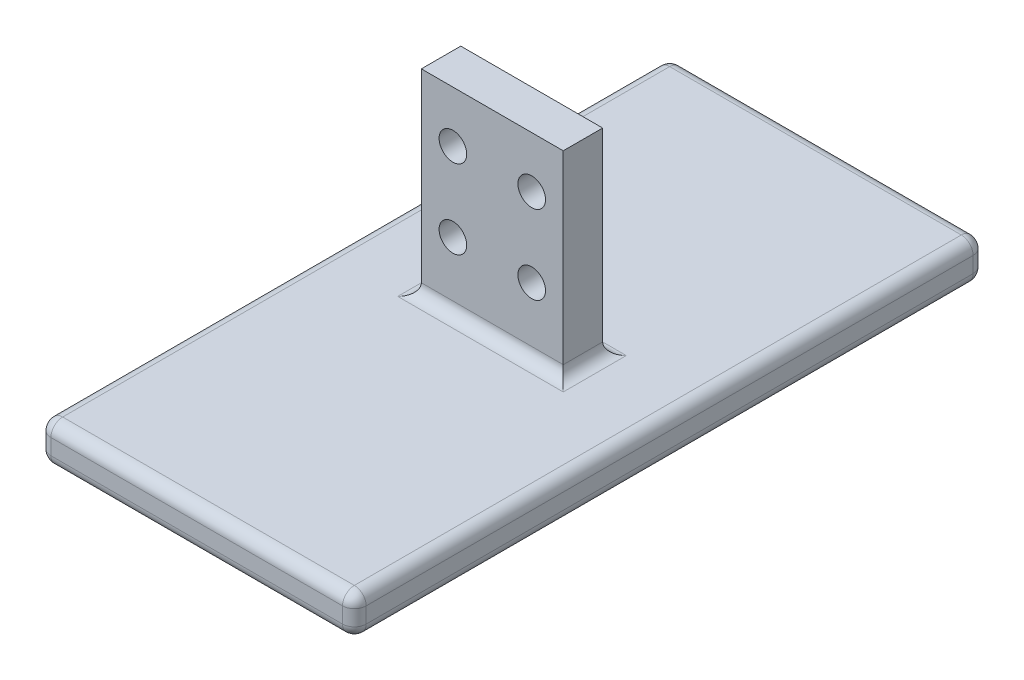
ISO-10303-21;
HEADER;
FILE_DESCRIPTION(('STEP AP214'),'2;1');
FILE_NAME('part.step','',(''),(''),'','','');
FILE_SCHEMA(('AUTOMOTIVE_DESIGN { 1 0 10303 214 1 1 1 1 }'));
ENDSEC;
DATA;
#1=APPLICATION_CONTEXT('core data for automotive mechanical design processes');
#2=APPLICATION_PROTOCOL_DEFINITION('international standard','automotive_design',2000,#1);
#3=PRODUCT_CONTEXT('',#1,'mechanical');
#4=PRODUCT('Part','Part','',(#3));
#5=PRODUCT_RELATED_PRODUCT_CATEGORY('part','',(#4));
#6=PRODUCT_DEFINITION_FORMATION('','',#4);
#7=PRODUCT_DEFINITION_CONTEXT('part definition',#1,'design');
#8=PRODUCT_DEFINITION('design','',#6,#7);
#9=PRODUCT_DEFINITION_SHAPE('','',#8);
#10=(LENGTH_UNIT() NAMED_UNIT(*) SI_UNIT(.MILLI.,.METRE.));
#11=(NAMED_UNIT(*) PLANE_ANGLE_UNIT() SI_UNIT($,.RADIAN.));
#12=(NAMED_UNIT(*) SI_UNIT($,.STERADIAN.) SOLID_ANGLE_UNIT());
#13=UNCERTAINTY_MEASURE_WITH_UNIT(LENGTH_MEASURE(1.E-05),#10,'distance_accuracy_value','');
#14=(GEOMETRIC_REPRESENTATION_CONTEXT(3) GLOBAL_UNCERTAINTY_ASSIGNED_CONTEXT((#13)) GLOBAL_UNIT_ASSIGNED_CONTEXT((#10,
#11,#12)) REPRESENTATION_CONTEXT('',''));
#15=CARTESIAN_POINT('',(0.,0.,0.));
#16=DIRECTION('',(0.,0.,1.));
#17=DIRECTION('',(1.,0.,0.));
#18=AXIS2_PLACEMENT_3D('',#15,#16,#17);
#19=CARTESIAN_POINT('',(-20.,2.5,-40.));
#20=DIRECTION('',(0.,1.,0.));
#21=DIRECTION('',(0.,0.,1.));
#22=AXIS2_PLACEMENT_3D('',#19,#20,#21);
#23=PLANE('',#22);
#24=DIRECTION('',(0.,0.,1.));
#25=VECTOR('',#24,1.);
#26=CARTESIAN_POINT('',(10.5,2.5,2.5));
#27=LINE('',#26,#25);
#28=CARTESIAN_POINT('',(10.5,2.5,-4.));
#29=VERTEX_POINT('',#28);
#30=CARTESIAN_POINT('',(10.5,2.5,4.));
#31=VERTEX_POINT('',#30);
#32=EDGE_CURVE('E227',#29,#31,#27,.T.);
#33=ORIENTED_EDGE('',*,*,#32,.T.);
#34=DIRECTION('',(1.,0.,0.));
#35=VECTOR('',#34,1.);
#36=CARTESIAN_POINT('',(-9.00000000000001,2.5,4.));
#37=LINE('',#36,#35);
#38=CARTESIAN_POINT('',(-10.5,2.5,4.));
#39=VERTEX_POINT('',#38);
#40=EDGE_CURVE('E229',#31,#39,#37,.F.);
#41=ORIENTED_EDGE('',*,*,#40,.T.);
#42=DIRECTION('',(0.,0.,1.));
#43=VECTOR('',#42,1.);
#44=CARTESIAN_POINT('',(-10.5,2.5,-2.5));
#45=LINE('',#44,#43);
#46=CARTESIAN_POINT('',(-10.5,2.5,-4.));
#47=VERTEX_POINT('',#46);
#48=EDGE_CURVE('E223',#39,#47,#45,.F.);
#49=ORIENTED_EDGE('',*,*,#48,.T.);
#50=DIRECTION('',(1.,0.,0.));
#51=VECTOR('',#50,1.);
#52=CARTESIAN_POINT('',(-20.,2.5,-4.));
#53=LINE('',#52,#51);
#54=EDGE_CURVE('E225',#47,#29,#53,.T.);
#55=ORIENTED_EDGE('',*,*,#54,.T.);
#56=EDGE_LOOP('',(#33,#41,#49,#55));
#57=FACE_BOUND('',#56,.T.);
#58=DIRECTION('',(0.,0.,1.));
#59=VECTOR('',#58,1.);
#60=CARTESIAN_POINT('',(18.5,2.5,-40.));
#61=LINE('',#60,#59);
#62=CARTESIAN_POINT('',(18.5,2.5,38.5));
#63=VERTEX_POINT('',#62);
#64=CARTESIAN_POINT('',(18.5,2.5,-38.5));
#65=VERTEX_POINT('',#64);
#66=EDGE_CURVE('E217',#63,#65,#61,.F.);
#67=ORIENTED_EDGE('',*,*,#66,.T.);
#68=DIRECTION('',(-1.,0.,0.));
#69=VECTOR('',#68,1.);
#70=CARTESIAN_POINT('',(-20.,2.5,-38.5));
#71=LINE('',#70,#69);
#72=CARTESIAN_POINT('',(-18.5,2.5,-38.5));
#73=VERTEX_POINT('',#72);
#74=EDGE_CURVE('E220',#65,#73,#71,.T.);
#75=ORIENTED_EDGE('',*,*,#74,.T.);
#76=DIRECTION('',(0.,0.,1.));
#77=VECTOR('',#76,1.);
#78=CARTESIAN_POINT('',(-18.5,2.5,-40.));
#79=LINE('',#78,#77);
#80=CARTESIAN_POINT('',(-18.5,2.5,38.5));
#81=VERTEX_POINT('',#80);
#82=EDGE_CURVE('E211',#73,#81,#79,.T.);
#83=ORIENTED_EDGE('',*,*,#82,.T.);
#84=DIRECTION('',(-1.,0.,0.));
#85=VECTOR('',#84,1.);
#86=CARTESIAN_POINT('',(-20.,2.5,38.5));
#87=LINE('',#86,#85);
#88=EDGE_CURVE('E214',#81,#63,#87,.F.);
#89=ORIENTED_EDGE('',*,*,#88,.T.);
#90=EDGE_LOOP('',(#67,#75,#83,#89));
#91=FACE_BOUND('',#90,.T.);
#92=ADVANCED_FACE('F35',(#57,#91),#23,.T.);
#93=CARTESIAN_POINT('',(20.,2.5,-40.));
#94=DIRECTION('',(1.,0.,0.));
#95=DIRECTION('',(0.,0.,-1.));
#96=AXIS2_PLACEMENT_3D('',#93,#94,#95);
#97=PLANE('',#96);
#98=DIRECTION('',(0.,0.,1.));
#99=VECTOR('',#98,1.);
#100=CARTESIAN_POINT('',(20.,-1.,-40.));
#101=LINE('',#100,#99);
#102=CARTESIAN_POINT('',(20.,-1.,38.5));
#103=VERTEX_POINT('',#102);
#104=CARTESIAN_POINT('',(20.,-1.,-38.5));
#105=VERTEX_POINT('',#104);
#106=EDGE_CURVE('E244',#103,#105,#101,.F.);
#107=ORIENTED_EDGE('',*,*,#106,.T.);
#108=DIRECTION('',(0.,1.,0.));
#109=VECTOR('',#108,1.);
#110=CARTESIAN_POINT('',(20.,1.,-38.5));
#111=LINE('',#110,#109);
#112=CARTESIAN_POINT('',(20.,1.,-38.5));
#113=VERTEX_POINT('',#112);
#114=EDGE_CURVE('E340',#105,#113,#111,.T.);
#115=ORIENTED_EDGE('',*,*,#114,.T.);
#116=DIRECTION('',(0.,0.,1.));
#117=VECTOR('',#116,1.);
#118=CARTESIAN_POINT('',(20.,1.,-40.));
#119=LINE('',#118,#117);
#120=CARTESIAN_POINT('',(20.,1.,38.5));
#121=VERTEX_POINT('',#120);
#122=EDGE_CURVE('E247',#113,#121,#119,.T.);
#123=ORIENTED_EDGE('',*,*,#122,.T.);
#124=DIRECTION('',(0.,1.,0.));
#125=VECTOR('',#124,1.);
#126=CARTESIAN_POINT('',(20.,2.5,38.5));
#127=LINE('',#126,#125);
#128=EDGE_CURVE('E307',#121,#103,#127,.F.);
#129=ORIENTED_EDGE('',*,*,#128,.T.);
#130=EDGE_LOOP('',(#107,#115,#123,#129));
#131=FACE_BOUND('',#130,.T.);
#132=ADVANCED_FACE('F415',(#131),#97,.T.);
#133=CARTESIAN_POINT('',(-20.,-2.5,-40.));
#134=DIRECTION('',(0.,-1.,0.));
#135=DIRECTION('',(0.,0.,-1.));
#136=AXIS2_PLACEMENT_3D('',#133,#134,#135);
#137=PLANE('',#136);
#138=DIRECTION('',(0.,0.,1.));
#139=VECTOR('',#138,1.);
#140=CARTESIAN_POINT('',(-18.5,-2.5,-40.));
#141=LINE('',#140,#139);
#142=CARTESIAN_POINT('',(-18.5,-2.5,38.5));
#143=VERTEX_POINT('',#142);
#144=CARTESIAN_POINT('',(-18.5,-2.5,-38.5));
#145=VERTEX_POINT('',#144);
#146=EDGE_CURVE('E265',#143,#145,#141,.F.);
#147=ORIENTED_EDGE('',*,*,#146,.T.);
#148=DIRECTION('',(1.,0.,0.));
#149=VECTOR('',#148,1.);
#150=CARTESIAN_POINT('',(20.,-2.5,-38.5));
#151=LINE('',#150,#149);
#152=CARTESIAN_POINT('',(18.5,-2.5,-38.5));
#153=VERTEX_POINT('',#152);
#154=EDGE_CURVE('E268',#145,#153,#151,.T.);
#155=ORIENTED_EDGE('',*,*,#154,.T.);
#156=DIRECTION('',(0.,0.,1.));
#157=VECTOR('',#156,1.);
#158=CARTESIAN_POINT('',(18.5,-2.5,-40.));
#159=LINE('',#158,#157);
#160=CARTESIAN_POINT('',(18.5,-2.5,38.5));
#161=VERTEX_POINT('',#160);
#162=EDGE_CURVE('E259',#153,#161,#159,.T.);
#163=ORIENTED_EDGE('',*,*,#162,.T.);
#164=DIRECTION('',(1.,0.,0.));
#165=VECTOR('',#164,1.);
#166=CARTESIAN_POINT('',(-20.,-2.5,38.5));
#167=LINE('',#166,#165);
#168=EDGE_CURVE('E262',#161,#143,#167,.F.);
#169=ORIENTED_EDGE('',*,*,#168,.T.);
#170=EDGE_LOOP('',(#147,#155,#163,#169));
#171=FACE_BOUND('',#170,.T.);
#172=ADVANCED_FACE('F368',(#171),#137,.T.);
#173=CARTESIAN_POINT('',(-20.,2.5,-40.));
#174=DIRECTION('',(-1.,0.,0.));
#175=DIRECTION('',(0.,0.,1.));
#176=AXIS2_PLACEMENT_3D('',#173,#174,#175);
#177=PLANE('',#176);
#178=DIRECTION('',(0.,0.,1.));
#179=VECTOR('',#178,1.);
#180=CARTESIAN_POINT('',(-20.,1.,-40.));
#181=LINE('',#180,#179);
#182=CARTESIAN_POINT('',(-20.,1.,38.5));
#183=VERTEX_POINT('',#182);
#184=CARTESIAN_POINT('',(-20.,1.,-38.5));
#185=VERTEX_POINT('',#184);
#186=EDGE_CURVE('E257',#183,#185,#181,.F.);
#187=ORIENTED_EDGE('',*,*,#186,.T.);
#188=DIRECTION('',(0.,-1.,0.));
#189=VECTOR('',#188,1.);
#190=CARTESIAN_POINT('',(-20.,-1.,-38.5));
#191=LINE('',#190,#189);
#192=CARTESIAN_POINT('',(-20.,-1.,-38.5));
#193=VERTEX_POINT('',#192);
#194=EDGE_CURVE('E11',#185,#193,#191,.T.);
#195=ORIENTED_EDGE('',*,*,#194,.T.);
#196=DIRECTION('',(0.,0.,1.));
#197=VECTOR('',#196,1.);
#198=CARTESIAN_POINT('',(-20.,-1.,-40.));
#199=LINE('',#198,#197);
#200=CARTESIAN_POINT('',(-20.,-1.,38.5));
#201=VERTEX_POINT('',#200);
#202=EDGE_CURVE('E255',#193,#201,#199,.T.);
#203=ORIENTED_EDGE('',*,*,#202,.T.);
#204=DIRECTION('',(0.,-1.,0.));
#205=VECTOR('',#204,1.);
#206=CARTESIAN_POINT('',(-20.,2.5,38.5));
#207=LINE('',#206,#205);
#208=EDGE_CURVE('E309',#201,#183,#207,.F.);
#209=ORIENTED_EDGE('',*,*,#208,.T.);
#210=EDGE_LOOP('',(#187,#195,#203,#209));
#211=FACE_BOUND('',#210,.T.);
#212=ADVANCED_FACE('F394',(#211),#177,.T.);
#213=CARTESIAN_POINT('',(0.,0.,-40.));
#214=DIRECTION('',(0.,0.,1.));
#215=DIRECTION('',(1.,0.,0.));
#216=AXIS2_PLACEMENT_3D('',#213,#214,#215);
#217=PLANE('',#216);
#218=DIRECTION('',(-1.,0.,0.));
#219=VECTOR('',#218,1.);
#220=CARTESIAN_POINT('',(20.,1.,-40.));
#221=LINE('',#220,#219);
#222=CARTESIAN_POINT('',(-18.5,1.,-40.));
#223=VERTEX_POINT('',#222);
#224=CARTESIAN_POINT('',(18.5,1.,-40.));
#225=VERTEX_POINT('',#224);
#226=EDGE_CURVE('E241',#223,#225,#221,.F.);
#227=ORIENTED_EDGE('',*,*,#226,.T.);
#228=DIRECTION('',(0.,1.,0.));
#229=VECTOR('',#228,1.);
#230=CARTESIAN_POINT('',(18.5,-1.,-40.));
#231=LINE('',#230,#229);
#232=CARTESIAN_POINT('',(18.5,-1.,-40.));
#233=VERTEX_POINT('',#232);
#234=EDGE_CURVE('E44',#225,#233,#231,.F.);
#235=ORIENTED_EDGE('',*,*,#234,.T.);
#236=DIRECTION('',(1.,0.,0.));
#237=VECTOR('',#236,1.);
#238=CARTESIAN_POINT('',(-20.,-1.,-40.));
#239=LINE('',#238,#237);
#240=CARTESIAN_POINT('',(-18.5,-1.,-40.));
#241=VERTEX_POINT('',#240);
#242=EDGE_CURVE('E238',#233,#241,#239,.F.);
#243=ORIENTED_EDGE('',*,*,#242,.T.);
#244=DIRECTION('',(0.,-1.,0.));
#245=VECTOR('',#244,1.);
#246=CARTESIAN_POINT('',(-18.5,1.,-40.));
#247=LINE('',#246,#245);
#248=EDGE_CURVE('E342',#241,#223,#247,.F.);
#249=ORIENTED_EDGE('',*,*,#248,.T.);
#250=EDGE_LOOP('',(#227,#235,#243,#249));
#251=FACE_BOUND('',#250,.T.);
#252=ADVANCED_FACE('F432',(#251),#217,.F.);
#253=CARTESIAN_POINT('',(0.,0.,40.));
#254=DIRECTION('',(0.,0.,1.));
#255=DIRECTION('',(1.,0.,0.));
#256=AXIS2_PLACEMENT_3D('',#253,#254,#255);
#257=PLANE('',#256);
#258=DIRECTION('',(1.,0.,0.));
#259=VECTOR('',#258,1.);
#260=CARTESIAN_POINT('',(0.,-1.,40.));
#261=LINE('',#260,#259);
#262=CARTESIAN_POINT('',(-18.5,-1.,40.));
#263=VERTEX_POINT('',#262);
#264=CARTESIAN_POINT('',(18.5,-1.,40.));
#265=VERTEX_POINT('',#264);
#266=EDGE_CURVE('E249',#263,#265,#261,.T.);
#267=ORIENTED_EDGE('',*,*,#266,.T.);
#268=DIRECTION('',(0.,1.,0.));
#269=VECTOR('',#268,1.);
#270=CARTESIAN_POINT('',(18.5,0.,40.));
#271=LINE('',#270,#269);
#272=CARTESIAN_POINT('',(18.5,1.,40.));
#273=VERTEX_POINT('',#272);
#274=EDGE_CURVE('E305',#265,#273,#271,.T.);
#275=ORIENTED_EDGE('',*,*,#274,.T.);
#276=DIRECTION('',(-1.,0.,0.));
#277=VECTOR('',#276,1.);
#278=CARTESIAN_POINT('',(0.,1.,40.));
#279=LINE('',#278,#277);
#280=CARTESIAN_POINT('',(-18.5,1.,40.));
#281=VERTEX_POINT('',#280);
#282=EDGE_CURVE('E252',#273,#281,#279,.T.);
#283=ORIENTED_EDGE('',*,*,#282,.T.);
#284=DIRECTION('',(0.,-1.,0.));
#285=VECTOR('',#284,1.);
#286=CARTESIAN_POINT('',(-18.5,0.,40.));
#287=LINE('',#286,#285);
#288=EDGE_CURVE('E303',#281,#263,#287,.T.);
#289=ORIENTED_EDGE('',*,*,#288,.T.);
#290=EDGE_LOOP('',(#267,#275,#283,#289));
#291=FACE_BOUND('',#290,.T.);
#292=ADVANCED_FACE('F721',(#291),#257,.T.);
#293=CARTESIAN_POINT('',(8.99999999999999,27.5,-2.5));
#294=DIRECTION('',(1.,0.,0.));
#295=DIRECTION('',(0.,1.,0.));
#296=AXIS2_PLACEMENT_3D('',#293,#294,#295);
#297=PLANE('',#296);
#298=DIRECTION('',(0.,1.,0.));
#299=VECTOR('',#298,1.);
#300=CARTESIAN_POINT('',(8.99999999999999,27.5,2.5));
#301=LINE('',#300,#299);
#302=CARTESIAN_POINT('',(9.,4.,2.5));
#303=VERTEX_POINT('',#302);
#304=CARTESIAN_POINT('',(8.99999999999999,27.5,2.5));
#305=VERTEX_POINT('',#304);
#306=EDGE_CURVE('E162',#303,#305,#301,.T.);
#307=ORIENTED_EDGE('',*,*,#306,.F.);
#308=DIRECTION('',(0.,0.,1.));
#309=VECTOR('',#308,1.);
#310=CARTESIAN_POINT('',(9.,4.,-2.5));
#311=LINE('',#310,#309);
#312=CARTESIAN_POINT('',(9.,4.,-2.5));
#313=VERTEX_POINT('',#312);
#314=EDGE_CURVE('E232',#303,#313,#311,.F.);
#315=ORIENTED_EDGE('',*,*,#314,.T.);
#316=DIRECTION('',(0.,1.,0.));
#317=VECTOR('',#316,1.);
#318=CARTESIAN_POINT('',(8.99999999999999,27.5,-2.5));
#319=LINE('',#318,#317);
#320=CARTESIAN_POINT('',(8.99999999999999,27.5,-2.5));
#321=VERTEX_POINT('',#320);
#322=EDGE_CURVE('E179',#313,#321,#319,.T.);
#323=ORIENTED_EDGE('',*,*,#322,.T.);
#324=DIRECTION('',(0.,0.,1.));
#325=VECTOR('',#324,1.);
#326=CARTESIAN_POINT('',(8.99999999999999,27.5,-2.5));
#327=LINE('',#326,#325);
#328=EDGE_CURVE('E176',#321,#305,#327,.T.);
#329=ORIENTED_EDGE('',*,*,#328,.T.);
#330=EDGE_LOOP('',(#307,#315,#323,#329));
#331=FACE_BOUND('',#330,.T.);
#332=ADVANCED_FACE('F177',(#331),#297,.T.);
#333=CARTESIAN_POINT('',(-9.00000000000001,27.5,-2.5));
#334=DIRECTION('',(-1.,0.,0.));
#335=DIRECTION('',(0.,-1.,0.));
#336=AXIS2_PLACEMENT_3D('',#333,#334,#335);
#337=PLANE('',#336);
#338=DIRECTION('',(0.,-1.,0.));
#339=VECTOR('',#338,1.);
#340=CARTESIAN_POINT('',(-9.00000000000001,27.5,-2.5));
#341=LINE('',#340,#339);
#342=CARTESIAN_POINT('',(-9.00000000000001,27.5,-2.5));
#343=VERTEX_POINT('',#342);
#344=CARTESIAN_POINT('',(-9.,4.,-2.5));
#345=VERTEX_POINT('',#344);
#346=EDGE_CURVE('E184',#343,#345,#341,.T.);
#347=ORIENTED_EDGE('',*,*,#346,.T.);
#348=DIRECTION('',(0.,0.,1.));
#349=VECTOR('',#348,1.);
#350=CARTESIAN_POINT('',(-9.,4.,2.5));
#351=LINE('',#350,#349);
#352=CARTESIAN_POINT('',(-9.,4.,2.5));
#353=VERTEX_POINT('',#352);
#354=EDGE_CURVE('E236',#345,#353,#351,.T.);
#355=ORIENTED_EDGE('',*,*,#354,.T.);
#356=DIRECTION('',(0.,-1.,0.));
#357=VECTOR('',#356,1.);
#358=CARTESIAN_POINT('',(-9.00000000000001,27.5,2.5));
#359=LINE('',#358,#357);
#360=CARTESIAN_POINT('',(-9.00000000000001,27.5,2.5));
#361=VERTEX_POINT('',#360);
#362=EDGE_CURVE('E187',#361,#353,#359,.T.);
#363=ORIENTED_EDGE('',*,*,#362,.F.);
#364=DIRECTION('',(0.,0.,1.));
#365=VECTOR('',#364,1.);
#366=CARTESIAN_POINT('',(-9.00000000000001,27.5,-2.5));
#367=LINE('',#366,#365);
#368=EDGE_CURVE('E183',#343,#361,#367,.T.);
#369=ORIENTED_EDGE('',*,*,#368,.F.);
#370=EDGE_LOOP('',(#347,#355,#363,#369));
#371=FACE_BOUND('',#370,.T.);
#372=ADVANCED_FACE('F707',(#371),#337,.T.);
#373=CARTESIAN_POINT('',(-9.00000000000001,27.5,-2.5));
#374=DIRECTION('',(0.,1.,0.));
#375=DIRECTION('',(0.,0.,1.));
#376=AXIS2_PLACEMENT_3D('',#373,#374,#375);
#377=PLANE('',#376);
#378=ORIENTED_EDGE('',*,*,#368,.T.);
#379=DIRECTION('',(-1.,0.,0.));
#380=VECTOR('',#379,1.);
#381=CARTESIAN_POINT('',(-9.00000000000001,27.5,2.5));
#382=LINE('',#381,#380);
#383=EDGE_CURVE('E168',#305,#361,#382,.T.);
#384=ORIENTED_EDGE('',*,*,#383,.F.);
#385=ORIENTED_EDGE('',*,*,#328,.F.);
#386=DIRECTION('',(-1.,0.,0.));
#387=VECTOR('',#386,1.);
#388=CARTESIAN_POINT('',(-9.00000000000001,27.5,-2.5));
#389=LINE('',#388,#387);
#390=EDGE_CURVE('E205',#321,#343,#389,.T.);
#391=ORIENTED_EDGE('',*,*,#390,.T.);
#392=EDGE_LOOP('',(#378,#384,#385,#391));
#393=FACE_BOUND('',#392,.T.);
#394=ADVANCED_FACE('F186',(#393),#377,.T.);
#395=CARTESIAN_POINT('',(0.,0.,-2.5));
#396=DIRECTION('',(0.,0.,1.));
#397=DIRECTION('',(1.,0.,0.));
#398=AXIS2_PLACEMENT_3D('',#395,#396,#397);
#399=PLANE('',#398);
#400=CARTESIAN_POINT('',(-5.,21.,-2.5));
#401=DIRECTION('',(0.,0.,1.));
#402=DIRECTION('',(1.,0.,0.));
#403=AXIS2_PLACEMENT_3D('',#400,#401,#402);
#404=CIRCLE('',#403,1.75);
#405=CARTESIAN_POINT('',(-3.25,21.,-2.5));
#406=VERTEX_POINT('',#405);
#407=EDGE_CURVE('E189',#406,#406,#404,.T.);
#408=ORIENTED_EDGE('',*,*,#407,.T.);
#409=EDGE_LOOP('',(#408));
#410=FACE_BOUND('',#409,.T.);
#411=CARTESIAN_POINT('',(5.,21.,-2.5));
#412=DIRECTION('',(0.,0.,1.));
#413=DIRECTION('',(1.,0.,0.));
#414=AXIS2_PLACEMENT_3D('',#411,#412,#413);
#415=CIRCLE('',#414,1.75);
#416=CARTESIAN_POINT('',(6.75,21.,-2.5));
#417=VERTEX_POINT('',#416);
#418=EDGE_CURVE('E195',#417,#417,#415,.T.);
#419=ORIENTED_EDGE('',*,*,#418,.T.);
#420=EDGE_LOOP('',(#419));
#421=FACE_BOUND('',#420,.T.);
#422=CARTESIAN_POINT('',(-5.,11.,-2.5));
#423=DIRECTION('',(0.,0.,1.));
#424=DIRECTION('',(1.,0.,0.));
#425=AXIS2_PLACEMENT_3D('',#422,#423,#424);
#426=CIRCLE('',#425,1.75);
#427=CARTESIAN_POINT('',(-3.25,11.,-2.5));
#428=VERTEX_POINT('',#427);
#429=EDGE_CURVE('E198',#428,#428,#426,.T.);
#430=ORIENTED_EDGE('',*,*,#429,.T.);
#431=EDGE_LOOP('',(#430));
#432=FACE_BOUND('',#431,.T.);
#433=CARTESIAN_POINT('',(5.,11.,-2.5));
#434=DIRECTION('',(0.,0.,1.));
#435=DIRECTION('',(1.,0.,0.));
#436=AXIS2_PLACEMENT_3D('',#433,#434,#435);
#437=CIRCLE('',#436,1.75);
#438=CARTESIAN_POINT('',(6.75,11.,-2.5));
#439=VERTEX_POINT('',#438);
#440=EDGE_CURVE('E201',#439,#439,#437,.T.);
#441=ORIENTED_EDGE('',*,*,#440,.T.);
#442=EDGE_LOOP('',(#441));
#443=FACE_BOUND('',#442,.T.);
#444=ORIENTED_EDGE('',*,*,#322,.F.);
#445=DIRECTION('',(1.,0.,0.));
#446=VECTOR('',#445,1.);
#447=CARTESIAN_POINT('',(0.,4.,-2.5));
#448=LINE('',#447,#446);
#449=EDGE_CURVE('E234',#313,#345,#448,.F.);
#450=ORIENTED_EDGE('',*,*,#449,.T.);
#451=ORIENTED_EDGE('',*,*,#346,.F.);
#452=ORIENTED_EDGE('',*,*,#390,.F.);
#453=EDGE_LOOP('',(#444,#450,#451,#452));
#454=FACE_BOUND('',#453,.T.);
#455=ADVANCED_FACE('F690',(#410,#421,#432,#443,#454),#399,.F.);
#456=CARTESIAN_POINT('',(5.,11.,-2.5));
#457=DIRECTION('',(0.,0.,1.));
#458=DIRECTION('',(1.,0.,0.));
#459=AXIS2_PLACEMENT_3D('',#456,#457,#458);
#460=CYLINDRICAL_SURFACE('',#459,1.75);
#461=ORIENTED_EDGE('',*,*,#440,.F.);
#462=EDGE_LOOP('',(#461));
#463=FACE_BOUND('',#462,.T.);
#464=CARTESIAN_POINT('',(5.,11.,2.5));
#465=DIRECTION('',(0.,0.,1.));
#466=DIRECTION('',(1.,0.,0.));
#467=AXIS2_PLACEMENT_3D('',#464,#465,#466);
#468=CIRCLE('',#467,1.75);
#469=CARTESIAN_POINT('',(6.75,11.,2.5));
#470=VERTEX_POINT('',#469);
#471=EDGE_CURVE('E173',#470,#470,#468,.T.);
#472=ORIENTED_EDGE('',*,*,#471,.T.);
#473=EDGE_LOOP('',(#472));
#474=FACE_BOUND('',#473,.T.);
#475=ADVANCED_FACE('F681',(#463,#474),#460,.F.);
#476=CARTESIAN_POINT('',(-5.,11.,-2.5));
#477=DIRECTION('',(0.,0.,1.));
#478=DIRECTION('',(1.,0.,0.));
#479=AXIS2_PLACEMENT_3D('',#476,#477,#478);
#480=CYLINDRICAL_SURFACE('',#479,1.75);
#481=ORIENTED_EDGE('',*,*,#429,.F.);
#482=EDGE_LOOP('',(#481));
#483=FACE_BOUND('',#482,.T.);
#484=CARTESIAN_POINT('',(-5.,11.,2.5));
#485=DIRECTION('',(0.,0.,1.));
#486=DIRECTION('',(1.,0.,0.));
#487=AXIS2_PLACEMENT_3D('',#484,#485,#486);
#488=CIRCLE('',#487,1.75);
#489=CARTESIAN_POINT('',(-3.25,11.,2.5));
#490=VERTEX_POINT('',#489);
#491=EDGE_CURVE('E812',#490,#490,#488,.T.);
#492=ORIENTED_EDGE('',*,*,#491,.T.);
#493=EDGE_LOOP('',(#492));
#494=FACE_BOUND('',#493,.T.);
#495=ADVANCED_FACE('F672',(#483,#494),#480,.F.);
#496=CARTESIAN_POINT('',(5.,21.,-2.5));
#497=DIRECTION('',(0.,0.,1.));
#498=DIRECTION('',(1.,0.,0.));
#499=AXIS2_PLACEMENT_3D('',#496,#497,#498);
#500=CYLINDRICAL_SURFACE('',#499,1.75);
#501=ORIENTED_EDGE('',*,*,#418,.F.);
#502=EDGE_LOOP('',(#501));
#503=FACE_BOUND('',#502,.T.);
#504=CARTESIAN_POINT('',(5.,21.,2.5));
#505=DIRECTION('',(0.,0.,1.));
#506=DIRECTION('',(1.,0.,0.));
#507=AXIS2_PLACEMENT_3D('',#504,#505,#506);
#508=CIRCLE('',#507,1.75);
#509=CARTESIAN_POINT('',(6.75,21.,2.5));
#510=VERTEX_POINT('',#509);
#511=EDGE_CURVE('E814',#510,#510,#508,.T.);
#512=ORIENTED_EDGE('',*,*,#511,.T.);
#513=EDGE_LOOP('',(#512));
#514=FACE_BOUND('',#513,.T.);
#515=ADVANCED_FACE('F662',(#503,#514),#500,.F.);
#516=CARTESIAN_POINT('',(-5.,21.,-2.5));
#517=DIRECTION('',(0.,0.,1.));
#518=DIRECTION('',(1.,0.,0.));
#519=AXIS2_PLACEMENT_3D('',#516,#517,#518);
#520=CYLINDRICAL_SURFACE('',#519,1.75);
#521=ORIENTED_EDGE('',*,*,#407,.F.);
#522=EDGE_LOOP('',(#521));
#523=FACE_BOUND('',#522,.T.);
#524=CARTESIAN_POINT('',(-5.,21.,2.5));
#525=DIRECTION('',(0.,0.,1.));
#526=DIRECTION('',(1.,0.,0.));
#527=AXIS2_PLACEMENT_3D('',#524,#525,#526);
#528=CIRCLE('',#527,1.75);
#529=CARTESIAN_POINT('',(-3.25,21.,2.5));
#530=VERTEX_POINT('',#529);
#531=EDGE_CURVE('E283',#530,#530,#528,.T.);
#532=ORIENTED_EDGE('',*,*,#531,.T.);
#533=EDGE_LOOP('',(#532));
#534=FACE_BOUND('',#533,.T.);
#535=ADVANCED_FACE('F652',(#523,#534),#520,.F.);
#536=CARTESIAN_POINT('',(0.,0.,2.5));
#537=DIRECTION('',(0.,0.,1.));
#538=DIRECTION('',(1.,0.,0.));
#539=AXIS2_PLACEMENT_3D('',#536,#537,#538);
#540=PLANE('',#539);
#541=ORIENTED_EDGE('',*,*,#511,.F.);
#542=EDGE_LOOP('',(#541));
#543=FACE_BOUND('',#542,.T.);
#544=ORIENTED_EDGE('',*,*,#471,.F.);
#545=EDGE_LOOP('',(#544));
#546=FACE_BOUND('',#545,.T.);
#547=ORIENTED_EDGE('',*,*,#362,.T.);
#548=DIRECTION('',(1.,0.,0.));
#549=VECTOR('',#548,1.);
#550=CARTESIAN_POINT('',(9.,4.,2.5));
#551=LINE('',#550,#549);
#552=EDGE_CURVE('E171',#353,#303,#551,.T.);
#553=ORIENTED_EDGE('',*,*,#552,.T.);
#554=ORIENTED_EDGE('',*,*,#306,.T.);
#555=ORIENTED_EDGE('',*,*,#383,.T.);
#556=EDGE_LOOP('',(#547,#553,#554,#555));
#557=FACE_BOUND('',#556,.T.);
#558=ORIENTED_EDGE('',*,*,#491,.F.);
#559=EDGE_LOOP('',(#558));
#560=FACE_BOUND('',#559,.T.);
#561=ORIENTED_EDGE('',*,*,#531,.F.);
#562=EDGE_LOOP('',(#561));
#563=FACE_BOUND('',#562,.T.);
#564=ADVANCED_FACE('F165',(#543,#546,#557,#560,#563),#540,.T.);
#565=CARTESIAN_POINT('',(-20.,4.,-4.));
#566=DIRECTION('',(1.,0.,0.));
#567=DIRECTION('',(0.,0.,-1.));
#568=AXIS2_PLACEMENT_3D('',#565,#566,#567);
#569=CYLINDRICAL_SURFACE('',#568,1.5);
#570=CARTESIAN_POINT('',(10.5,4.,-4.));
#571=DIRECTION('',(0.707106781186547,0.,0.707106781186547));
#572=DIRECTION('',(0.707106781186547,0.,-0.707106781186547));
#573=AXIS2_PLACEMENT_3D('',#570,#571,#572);
#574=ELLIPSE('',#573,2.12132034355964,1.5);
#575=EDGE_CURVE('E277',#29,#313,#574,.F.);
#576=ORIENTED_EDGE('',*,*,#575,.F.);
#577=ORIENTED_EDGE('',*,*,#54,.F.);
#578=CARTESIAN_POINT('',(-10.5,4.,-4.));
#579=DIRECTION('',(0.707106781186547,0.,-0.707106781186547));
#580=DIRECTION('',(-0.707106781186547,0.,-0.707106781186547));
#581=AXIS2_PLACEMENT_3D('',#578,#579,#580);
#582=ELLIPSE('',#581,2.12132034355964,1.5);
#583=EDGE_CURVE('E280',#345,#47,#582,.T.);
#584=ORIENTED_EDGE('',*,*,#583,.F.);
#585=ORIENTED_EDGE('',*,*,#449,.F.);
#586=EDGE_LOOP('',(#576,#577,#584,#585));
#587=FACE_BOUND('',#586,.T.);
#588=ADVANCED_FACE('F461',(#587),#569,.F.);
#589=CARTESIAN_POINT('',(-10.5,4.,-2.5));
#590=DIRECTION('',(0.,0.,-1.));
#591=DIRECTION('',(-1.,0.,0.));
#592=AXIS2_PLACEMENT_3D('',#589,#590,#591);
#593=CYLINDRICAL_SURFACE('',#592,1.5);
#594=ORIENTED_EDGE('',*,*,#583,.T.);
#595=ORIENTED_EDGE('',*,*,#48,.F.);
#596=CARTESIAN_POINT('',(-10.5,4.,4.));
#597=DIRECTION('',(-0.707106781186547,0.,-0.707106781186547));
#598=DIRECTION('',(0.707106781186547,0.,-0.707106781186547));
#599=AXIS2_PLACEMENT_3D('',#596,#597,#598);
#600=ELLIPSE('',#599,2.12132034355964,1.5);
#601=EDGE_CURVE('E274',#353,#39,#600,.T.);
#602=ORIENTED_EDGE('',*,*,#601,.F.);
#603=ORIENTED_EDGE('',*,*,#354,.F.);
#604=EDGE_LOOP('',(#594,#595,#602,#603));
#605=FACE_BOUND('',#604,.T.);
#606=ADVANCED_FACE('F457',(#605),#593,.F.);
#607=CARTESIAN_POINT('',(10.5,4.,-40.));
#608=DIRECTION('',(0.,0.,-1.));
#609=DIRECTION('',(-1.,0.,0.));
#610=AXIS2_PLACEMENT_3D('',#607,#608,#609);
#611=CYLINDRICAL_SURFACE('',#610,1.5);
#612=ORIENTED_EDGE('',*,*,#575,.T.);
#613=ORIENTED_EDGE('',*,*,#314,.F.);
#614=CARTESIAN_POINT('',(10.5,4.,4.));
#615=DIRECTION('',(0.707106781186547,0.,-0.707106781186547));
#616=DIRECTION('',(-0.707106781186547,0.,-0.707106781186547));
#617=AXIS2_PLACEMENT_3D('',#614,#615,#616);
#618=ELLIPSE('',#617,2.12132034355964,1.5);
#619=EDGE_CURVE('E272',#31,#303,#618,.T.);
#620=ORIENTED_EDGE('',*,*,#619,.F.);
#621=ORIENTED_EDGE('',*,*,#32,.F.);
#622=EDGE_LOOP('',(#612,#613,#620,#621));
#623=FACE_BOUND('',#622,.T.);
#624=ADVANCED_FACE('F453',(#623),#611,.F.);
#625=CARTESIAN_POINT('',(0.,4.,4.));
#626=DIRECTION('',(-1.,0.,0.));
#627=DIRECTION('',(0.,0.,1.));
#628=AXIS2_PLACEMENT_3D('',#625,#626,#627);
#629=CYLINDRICAL_SURFACE('',#628,1.5);
#630=ORIENTED_EDGE('',*,*,#601,.T.);
#631=ORIENTED_EDGE('',*,*,#40,.F.);
#632=ORIENTED_EDGE('',*,*,#619,.T.);
#633=ORIENTED_EDGE('',*,*,#552,.F.);
#634=EDGE_LOOP('',(#630,#631,#632,#633));
#635=FACE_BOUND('',#634,.T.);
#636=ADVANCED_FACE('F450',(#635),#629,.F.);
#637=CARTESIAN_POINT('',(0.,1.,38.5));
#638=DIRECTION('',(-1.,0.,0.));
#639=DIRECTION('',(0.,0.,1.));
#640=AXIS2_PLACEMENT_3D('',#637,#638,#639);
#641=CYLINDRICAL_SURFACE('',#640,1.5);
#642=ORIENTED_EDGE('',*,*,#282,.F.);
#643=CARTESIAN_POINT('',(18.5,1.,38.5));
#644=DIRECTION('',(-1.,0.,0.));
#645=DIRECTION('',(0.,0.,1.));
#646=AXIS2_PLACEMENT_3D('',#643,#644,#645);
#647=CIRCLE('',#646,1.5);
#648=EDGE_CURVE('E295',#273,#63,#647,.T.);
#649=ORIENTED_EDGE('',*,*,#648,.T.);
#650=ORIENTED_EDGE('',*,*,#88,.F.);
#651=CARTESIAN_POINT('',(-18.5,1.,38.5));
#652=DIRECTION('',(-1.,0.,0.));
#653=DIRECTION('',(0.,0.,1.));
#654=AXIS2_PLACEMENT_3D('',#651,#652,#653);
#655=CIRCLE('',#654,1.5);
#656=EDGE_CURVE('E293',#81,#281,#655,.F.);
#657=ORIENTED_EDGE('',*,*,#656,.T.);
#658=EDGE_LOOP('',(#642,#649,#650,#657));
#659=FACE_BOUND('',#658,.T.);
#660=ADVANCED_FACE('F403',(#659),#641,.T.);
#661=CARTESIAN_POINT('',(18.5,1.,-40.));
#662=DIRECTION('',(0.,0.,1.));
#663=DIRECTION('',(1.,0.,0.));
#664=AXIS2_PLACEMENT_3D('',#661,#662,#663);
#665=CYLINDRICAL_SURFACE('',#664,1.5);
#666=ORIENTED_EDGE('',*,*,#122,.F.);
#667=CARTESIAN_POINT('',(18.5,1.,-38.5));
#668=DIRECTION('',(0.,0.,1.));
#669=DIRECTION('',(1.,0.,0.));
#670=AXIS2_PLACEMENT_3D('',#667,#668,#669);
#671=CIRCLE('',#670,1.5);
#672=EDGE_CURVE('E335',#113,#65,#671,.T.);
#673=ORIENTED_EDGE('',*,*,#672,.T.);
#674=ORIENTED_EDGE('',*,*,#66,.F.);
#675=CARTESIAN_POINT('',(18.5,1.,38.5));
#676=DIRECTION('',(0.,0.,1.));
#677=DIRECTION('',(1.,0.,0.));
#678=AXIS2_PLACEMENT_3D('',#675,#676,#677);
#679=CIRCLE('',#678,1.5);
#680=EDGE_CURVE('E290',#63,#121,#679,.F.);
#681=ORIENTED_EDGE('',*,*,#680,.T.);
#682=EDGE_LOOP('',(#666,#673,#674,#681));
#683=FACE_BOUND('',#682,.T.);
#684=ADVANCED_FACE('F420',(#683),#665,.T.);
#685=CARTESIAN_POINT('',(-18.5,1.,-40.));
#686=DIRECTION('',(0.,0.,1.));
#687=DIRECTION('',(1.,0.,0.));
#688=AXIS2_PLACEMENT_3D('',#685,#686,#687);
#689=CYLINDRICAL_SURFACE('',#688,1.5);
#690=ORIENTED_EDGE('',*,*,#82,.F.);
#691=CARTESIAN_POINT('',(-18.5,1.,-38.5));
#692=DIRECTION('',(0.,0.,1.));
#693=DIRECTION('',(1.,0.,0.));
#694=AXIS2_PLACEMENT_3D('',#691,#692,#693);
#695=CIRCLE('',#694,1.5);
#696=EDGE_CURVE('E58',#73,#185,#695,.T.);
#697=ORIENTED_EDGE('',*,*,#696,.T.);
#698=ORIENTED_EDGE('',*,*,#186,.F.);
#699=CARTESIAN_POINT('',(-18.5,1.,38.5));
#700=DIRECTION('',(0.,0.,1.));
#701=DIRECTION('',(1.,0.,0.));
#702=AXIS2_PLACEMENT_3D('',#699,#700,#701);
#703=CIRCLE('',#702,1.5);
#704=EDGE_CURVE('E297',#183,#81,#703,.F.);
#705=ORIENTED_EDGE('',*,*,#704,.T.);
#706=EDGE_LOOP('',(#690,#697,#698,#705));
#707=FACE_BOUND('',#706,.T.);
#708=ADVANCED_FACE('F395',(#707),#689,.T.);
#709=CARTESIAN_POINT('',(-20.,1.,-38.5));
#710=DIRECTION('',(1.,0.,0.));
#711=DIRECTION('',(0.,0.,-1.));
#712=AXIS2_PLACEMENT_3D('',#709,#710,#711);
#713=CYLINDRICAL_SURFACE('',#712,1.5);
#714=ORIENTED_EDGE('',*,*,#74,.F.);
#715=CARTESIAN_POINT('',(18.5,1.,-38.5));
#716=DIRECTION('',(1.,0.,0.));
#717=DIRECTION('',(0.,0.,-1.));
#718=AXIS2_PLACEMENT_3D('',#715,#716,#717);
#719=CIRCLE('',#718,1.5);
#720=EDGE_CURVE('E333',#65,#225,#719,.F.);
#721=ORIENTED_EDGE('',*,*,#720,.T.);
#722=ORIENTED_EDGE('',*,*,#226,.F.);
#723=CARTESIAN_POINT('',(-18.5,1.,-38.5));
#724=DIRECTION('',(1.,0.,0.));
#725=DIRECTION('',(0.,0.,-1.));
#726=AXIS2_PLACEMENT_3D('',#723,#724,#725);
#727=CIRCLE('',#726,1.5);
#728=EDGE_CURVE('E330',#223,#73,#727,.T.);
#729=ORIENTED_EDGE('',*,*,#728,.T.);
#730=EDGE_LOOP('',(#714,#721,#722,#729));
#731=FACE_BOUND('',#730,.T.);
#732=ADVANCED_FACE('F423',(#731),#713,.T.);
#733=CARTESIAN_POINT('',(0.,-1.,38.5));
#734=DIRECTION('',(1.,0.,0.));
#735=DIRECTION('',(0.,0.,-1.));
#736=AXIS2_PLACEMENT_3D('',#733,#734,#735);
#737=CYLINDRICAL_SURFACE('',#736,1.5);
#738=ORIENTED_EDGE('',*,*,#168,.F.);
#739=CARTESIAN_POINT('',(18.5,-1.,38.5));
#740=DIRECTION('',(1.,0.,0.));
#741=DIRECTION('',(0.,0.,-1.));
#742=AXIS2_PLACEMENT_3D('',#739,#740,#741);
#743=CIRCLE('',#742,1.5);
#744=EDGE_CURVE('E288',#161,#265,#743,.F.);
#745=ORIENTED_EDGE('',*,*,#744,.T.);
#746=ORIENTED_EDGE('',*,*,#266,.F.);
#747=CARTESIAN_POINT('',(-18.5,-1.,38.5));
#748=DIRECTION('',(1.,0.,0.));
#749=DIRECTION('',(0.,0.,-1.));
#750=AXIS2_PLACEMENT_3D('',#747,#748,#749);
#751=CIRCLE('',#750,1.5);
#752=EDGE_CURVE('E286',#263,#143,#751,.T.);
#753=ORIENTED_EDGE('',*,*,#752,.T.);
#754=EDGE_LOOP('',(#738,#745,#746,#753));
#755=FACE_BOUND('',#754,.T.);
#756=ADVANCED_FACE('F382',(#755),#737,.T.);
#757=CARTESIAN_POINT('',(-18.5,-1.,-40.));
#758=DIRECTION('',(0.,0.,1.));
#759=DIRECTION('',(1.,0.,0.));
#760=AXIS2_PLACEMENT_3D('',#757,#758,#759);
#761=CYLINDRICAL_SURFACE('',#760,1.5);
#762=ORIENTED_EDGE('',*,*,#202,.F.);
#763=CARTESIAN_POINT('',(-18.5,-1.,-38.5));
#764=DIRECTION('',(0.,0.,1.));
#765=DIRECTION('',(1.,0.,0.));
#766=AXIS2_PLACEMENT_3D('',#763,#764,#765);
#767=CIRCLE('',#766,1.5);
#768=EDGE_CURVE('E338',#193,#145,#767,.T.);
#769=ORIENTED_EDGE('',*,*,#768,.T.);
#770=ORIENTED_EDGE('',*,*,#146,.F.);
#771=CARTESIAN_POINT('',(-18.5,-1.,38.5));
#772=DIRECTION('',(0.,0.,1.));
#773=DIRECTION('',(1.,0.,0.));
#774=AXIS2_PLACEMENT_3D('',#771,#772,#773);
#775=CIRCLE('',#774,1.5);
#776=EDGE_CURVE('E300',#143,#201,#775,.F.);
#777=ORIENTED_EDGE('',*,*,#776,.T.);
#778=EDGE_LOOP('',(#762,#769,#770,#777));
#779=FACE_BOUND('',#778,.T.);
#780=ADVANCED_FACE('F364',(#779),#761,.T.);
#781=CARTESIAN_POINT('',(18.5,-1.,-40.));
#782=DIRECTION('',(0.,0.,1.));
#783=DIRECTION('',(1.,0.,0.));
#784=AXIS2_PLACEMENT_3D('',#781,#782,#783);
#785=CYLINDRICAL_SURFACE('',#784,1.5);
#786=ORIENTED_EDGE('',*,*,#162,.F.);
#787=CARTESIAN_POINT('',(18.5,-1.,-38.5));
#788=DIRECTION('',(0.,0.,1.));
#789=DIRECTION('',(1.,0.,0.));
#790=AXIS2_PLACEMENT_3D('',#787,#788,#789);
#791=CIRCLE('',#790,1.5);
#792=EDGE_CURVE('E328',#153,#105,#791,.T.);
#793=ORIENTED_EDGE('',*,*,#792,.T.);
#794=ORIENTED_EDGE('',*,*,#106,.F.);
#795=CARTESIAN_POINT('',(18.5,-1.,38.5));
#796=DIRECTION('',(0.,0.,1.));
#797=DIRECTION('',(1.,0.,0.));
#798=AXIS2_PLACEMENT_3D('',#795,#796,#797);
#799=CIRCLE('',#798,1.5);
#800=EDGE_CURVE('E271',#103,#161,#799,.F.);
#801=ORIENTED_EDGE('',*,*,#800,.T.);
#802=EDGE_LOOP('',(#786,#793,#794,#801));
#803=FACE_BOUND('',#802,.T.);
#804=ADVANCED_FACE('F378',(#803),#785,.T.);
#805=CARTESIAN_POINT('',(-20.,-1.,-38.5));
#806=DIRECTION('',(-1.,0.,0.));
#807=DIRECTION('',(0.,0.,1.));
#808=AXIS2_PLACEMENT_3D('',#805,#806,#807);
#809=CYLINDRICAL_SURFACE('',#808,1.5);
#810=ORIENTED_EDGE('',*,*,#242,.F.);
#811=CARTESIAN_POINT('',(18.5,-1.,-38.5));
#812=DIRECTION('',(-1.,0.,0.));
#813=DIRECTION('',(0.,0.,1.));
#814=AXIS2_PLACEMENT_3D('',#811,#812,#813);
#815=CIRCLE('',#814,1.5);
#816=EDGE_CURVE('E325',#233,#153,#815,.T.);
#817=ORIENTED_EDGE('',*,*,#816,.T.);
#818=ORIENTED_EDGE('',*,*,#154,.F.);
#819=CARTESIAN_POINT('',(-18.5,-1.,-38.5));
#820=DIRECTION('',(-1.,0.,0.));
#821=DIRECTION('',(0.,0.,1.));
#822=AXIS2_PLACEMENT_3D('',#819,#820,#821);
#823=CIRCLE('',#822,1.5);
#824=EDGE_CURVE('E311',#145,#241,#823,.F.);
#825=ORIENTED_EDGE('',*,*,#824,.T.);
#826=EDGE_LOOP('',(#810,#817,#818,#825));
#827=FACE_BOUND('',#826,.T.);
#828=ADVANCED_FACE('F372',(#827),#809,.T.);
#829=CARTESIAN_POINT('',(18.5,1.,38.5));
#830=DIRECTION('',(0.,0.,1.));
#831=DIRECTION('',(1.,0.,0.));
#832=AXIS2_PLACEMENT_3D('',#829,#830,#831);
#833=SPHERICAL_SURFACE('',#832,1.5);
#834=ORIENTED_EDGE('',*,*,#680,.F.);
#835=ORIENTED_EDGE('',*,*,#648,.F.);
#836=CARTESIAN_POINT('',(18.5,1.,38.5));
#837=DIRECTION('',(0.,-1.,0.));
#838=DIRECTION('',(0.,0.,-1.));
#839=AXIS2_PLACEMENT_3D('',#836,#837,#838);
#840=CIRCLE('',#839,1.5);
#841=EDGE_CURVE('E275',#121,#273,#840,.T.);
#842=ORIENTED_EDGE('',*,*,#841,.F.);
#843=EDGE_LOOP('',(#834,#835,#842));
#844=FACE_BOUND('',#843,.T.);
#845=ADVANCED_FACE('F408',(#844),#833,.T.);
#846=CARTESIAN_POINT('',(18.5,0.,38.5));
#847=DIRECTION('',(0.,1.,0.));
#848=DIRECTION('',(0.,0.,1.));
#849=AXIS2_PLACEMENT_3D('',#846,#847,#848);
#850=CYLINDRICAL_SURFACE('',#849,1.5);
#851=ORIENTED_EDGE('',*,*,#841,.T.);
#852=ORIENTED_EDGE('',*,*,#274,.F.);
#853=CARTESIAN_POINT('',(18.5,-1.,38.5));
#854=DIRECTION('',(0.,-1.,0.));
#855=DIRECTION('',(0.,0.,-1.));
#856=AXIS2_PLACEMENT_3D('',#853,#854,#855);
#857=CIRCLE('',#856,1.5);
#858=EDGE_CURVE('E312',#103,#265,#857,.T.);
#859=ORIENTED_EDGE('',*,*,#858,.F.);
#860=ORIENTED_EDGE('',*,*,#128,.F.);
#861=EDGE_LOOP('',(#851,#852,#859,#860));
#862=FACE_BOUND('',#861,.T.);
#863=ADVANCED_FACE('F412',(#862),#850,.T.);
#864=CARTESIAN_POINT('',(18.5,-1.,38.5));
#865=DIRECTION('',(0.,0.,1.));
#866=DIRECTION('',(1.,0.,0.));
#867=AXIS2_PLACEMENT_3D('',#864,#865,#866);
#868=SPHERICAL_SURFACE('',#867,1.5);
#869=ORIENTED_EDGE('',*,*,#858,.T.);
#870=ORIENTED_EDGE('',*,*,#744,.F.);
#871=ORIENTED_EDGE('',*,*,#800,.F.);
#872=EDGE_LOOP('',(#869,#870,#871));
#873=FACE_BOUND('',#872,.T.);
#874=ADVANCED_FACE('F482',(#873),#868,.T.);
#875=CARTESIAN_POINT('',(-18.5,-1.,38.5));
#876=DIRECTION('',(0.,0.,1.));
#877=DIRECTION('',(1.,0.,0.));
#878=AXIS2_PLACEMENT_3D('',#875,#876,#877);
#879=SPHERICAL_SURFACE('',#878,1.5);
#880=ORIENTED_EDGE('',*,*,#776,.F.);
#881=ORIENTED_EDGE('',*,*,#752,.F.);
#882=CARTESIAN_POINT('',(-18.5,-1.,38.5));
#883=DIRECTION('',(0.,1.,0.));
#884=DIRECTION('',(0.,0.,1.));
#885=AXIS2_PLACEMENT_3D('',#882,#883,#884);
#886=CIRCLE('',#885,1.5);
#887=EDGE_CURVE('E315',#201,#263,#886,.T.);
#888=ORIENTED_EDGE('',*,*,#887,.F.);
#889=EDGE_LOOP('',(#880,#881,#888));
#890=FACE_BOUND('',#889,.T.);
#891=ADVANCED_FACE('F387',(#890),#879,.T.);
#892=CARTESIAN_POINT('',(-18.5,0.,38.5));
#893=DIRECTION('',(0.,-1.,0.));
#894=DIRECTION('',(0.,0.,-1.));
#895=AXIS2_PLACEMENT_3D('',#892,#893,#894);
#896=CYLINDRICAL_SURFACE('',#895,1.5);
#897=ORIENTED_EDGE('',*,*,#887,.T.);
#898=ORIENTED_EDGE('',*,*,#288,.F.);
#899=CARTESIAN_POINT('',(-18.5,1.,38.5));
#900=DIRECTION('',(0.,1.,0.));
#901=DIRECTION('',(0.,0.,1.));
#902=AXIS2_PLACEMENT_3D('',#899,#900,#901);
#903=CIRCLE('',#902,1.5);
#904=EDGE_CURVE('E318',#183,#281,#903,.T.);
#905=ORIENTED_EDGE('',*,*,#904,.F.);
#906=ORIENTED_EDGE('',*,*,#208,.F.);
#907=EDGE_LOOP('',(#897,#898,#905,#906));
#908=FACE_BOUND('',#907,.T.);
#909=ADVANCED_FACE('F391',(#908),#896,.T.);
#910=CARTESIAN_POINT('',(-18.5,1.,38.5));
#911=DIRECTION('',(0.,0.,1.));
#912=DIRECTION('',(1.,0.,0.));
#913=AXIS2_PLACEMENT_3D('',#910,#911,#912);
#914=SPHERICAL_SURFACE('',#913,1.5);
#915=ORIENTED_EDGE('',*,*,#904,.T.);
#916=ORIENTED_EDGE('',*,*,#656,.F.);
#917=ORIENTED_EDGE('',*,*,#704,.F.);
#918=EDGE_LOOP('',(#915,#916,#917));
#919=FACE_BOUND('',#918,.T.);
#920=ADVANCED_FACE('F490',(#919),#914,.T.);
#921=CARTESIAN_POINT('',(18.5,1.,-38.5));
#922=DIRECTION('',(0.,0.,1.));
#923=DIRECTION('',(1.,0.,0.));
#924=AXIS2_PLACEMENT_3D('',#921,#922,#923);
#925=SPHERICAL_SURFACE('',#924,1.5);
#926=ORIENTED_EDGE('',*,*,#720,.F.);
#927=ORIENTED_EDGE('',*,*,#672,.F.);
#928=CARTESIAN_POINT('',(18.5,1.,-38.5));
#929=DIRECTION('',(0.,-1.,0.));
#930=DIRECTION('',(0.,0.,-1.));
#931=AXIS2_PLACEMENT_3D('',#928,#929,#930);
#932=CIRCLE('',#931,1.5);
#933=EDGE_CURVE('E321',#225,#113,#932,.T.);
#934=ORIENTED_EDGE('',*,*,#933,.F.);
#935=EDGE_LOOP('',(#926,#927,#934));
#936=FACE_BOUND('',#935,.T.);
#937=ADVANCED_FACE('F427',(#936),#925,.T.);
#938=CARTESIAN_POINT('',(18.5,2.5,-38.5));
#939=DIRECTION('',(0.,-1.,0.));
#940=DIRECTION('',(0.,0.,-1.));
#941=AXIS2_PLACEMENT_3D('',#938,#939,#940);
#942=CYLINDRICAL_SURFACE('',#941,1.5);
#943=ORIENTED_EDGE('',*,*,#933,.T.);
#944=ORIENTED_EDGE('',*,*,#114,.F.);
#945=CARTESIAN_POINT('',(18.5,-1.,-38.5));
#946=DIRECTION('',(0.,-1.,0.));
#947=DIRECTION('',(0.,0.,-1.));
#948=AXIS2_PLACEMENT_3D('',#945,#946,#947);
#949=CIRCLE('',#948,1.5);
#950=EDGE_CURVE('E345',#233,#105,#949,.T.);
#951=ORIENTED_EDGE('',*,*,#950,.F.);
#952=ORIENTED_EDGE('',*,*,#234,.F.);
#953=EDGE_LOOP('',(#943,#944,#951,#952));
#954=FACE_BOUND('',#953,.T.);
#955=ADVANCED_FACE('F430',(#954),#942,.T.);
#956=CARTESIAN_POINT('',(18.5,-1.,-38.5));
#957=DIRECTION('',(0.,0.,1.));
#958=DIRECTION('',(1.,0.,0.));
#959=AXIS2_PLACEMENT_3D('',#956,#957,#958);
#960=SPHERICAL_SURFACE('',#959,1.5);
#961=ORIENTED_EDGE('',*,*,#950,.T.);
#962=ORIENTED_EDGE('',*,*,#792,.F.);
#963=ORIENTED_EDGE('',*,*,#816,.F.);
#964=EDGE_LOOP('',(#961,#962,#963));
#965=FACE_BOUND('',#964,.T.);
#966=ADVANCED_FACE('F497',(#965),#960,.T.);
#967=CARTESIAN_POINT('',(-18.5,-1.,-38.5));
#968=DIRECTION('',(0.,0.,1.));
#969=DIRECTION('',(1.,0.,0.));
#970=AXIS2_PLACEMENT_3D('',#967,#968,#969);
#971=SPHERICAL_SURFACE('',#970,1.5);
#972=ORIENTED_EDGE('',*,*,#824,.F.);
#973=ORIENTED_EDGE('',*,*,#768,.F.);
#974=CARTESIAN_POINT('',(-18.5,-1.,-38.5));
#975=DIRECTION('',(0.,1.,0.));
#976=DIRECTION('',(0.,0.,1.));
#977=AXIS2_PLACEMENT_3D('',#974,#975,#976);
#978=CIRCLE('',#977,1.5);
#979=EDGE_CURVE('E39',#241,#193,#978,.T.);
#980=ORIENTED_EDGE('',*,*,#979,.F.);
#981=EDGE_LOOP('',(#972,#973,#980));
#982=FACE_BOUND('',#981,.T.);
#983=ADVANCED_FACE('F37',(#982),#971,.T.);
#984=CARTESIAN_POINT('',(-18.5,2.5,-38.5));
#985=DIRECTION('',(0.,1.,0.));
#986=DIRECTION('',(0.,0.,1.));
#987=AXIS2_PLACEMENT_3D('',#984,#985,#986);
#988=CYLINDRICAL_SURFACE('',#987,1.5);
#989=ORIENTED_EDGE('',*,*,#979,.T.);
#990=ORIENTED_EDGE('',*,*,#194,.F.);
#991=CARTESIAN_POINT('',(-18.5,1.,-38.5));
#992=DIRECTION('',(0.,1.,0.));
#993=DIRECTION('',(0.,0.,1.));
#994=AXIS2_PLACEMENT_3D('',#991,#992,#993);
#995=CIRCLE('',#994,1.5);
#996=EDGE_CURVE('E349',#223,#185,#995,.T.);
#997=ORIENTED_EDGE('',*,*,#996,.F.);
#998=ORIENTED_EDGE('',*,*,#248,.F.);
#999=EDGE_LOOP('',(#989,#990,#997,#998));
#1000=FACE_BOUND('',#999,.T.);
#1001=ADVANCED_FACE('F358',(#1000),#988,.T.);
#1002=CARTESIAN_POINT('',(-18.5,1.,-38.5));
#1003=DIRECTION('',(0.,0.,1.));
#1004=DIRECTION('',(1.,0.,0.));
#1005=AXIS2_PLACEMENT_3D('',#1002,#1003,#1004);
#1006=SPHERICAL_SURFACE('',#1005,1.5);
#1007=ORIENTED_EDGE('',*,*,#996,.T.);
#1008=ORIENTED_EDGE('',*,*,#696,.F.);
#1009=ORIENTED_EDGE('',*,*,#728,.F.);
#1010=EDGE_LOOP('',(#1007,#1008,#1009));
#1011=FACE_BOUND('',#1010,.T.);
#1012=ADVANCED_FACE('F433',(#1011),#1006,.T.);
#1013=CLOSED_SHELL('',(#92,#132,#172,#212,#252,#292,#332,#372,#394,#455,#475,#495,#515,#535,
#564,#588,#606,#624,#636,#660,#684,#708,#732,#756,#780,#804,#828,#845,#863,#874,#891,#909,#920,
#937,#955,#966,#983,#1001,#1012));
#1014=MANIFOLD_SOLID_BREP('B2',#1013);
#1015=ADVANCED_BREP_SHAPE_REPRESENTATION('',(#18,#1014),#14);
#1016=SHAPE_DEFINITION_REPRESENTATION(#9,#1015);
ENDSEC;
END-ISO-10303-21;
